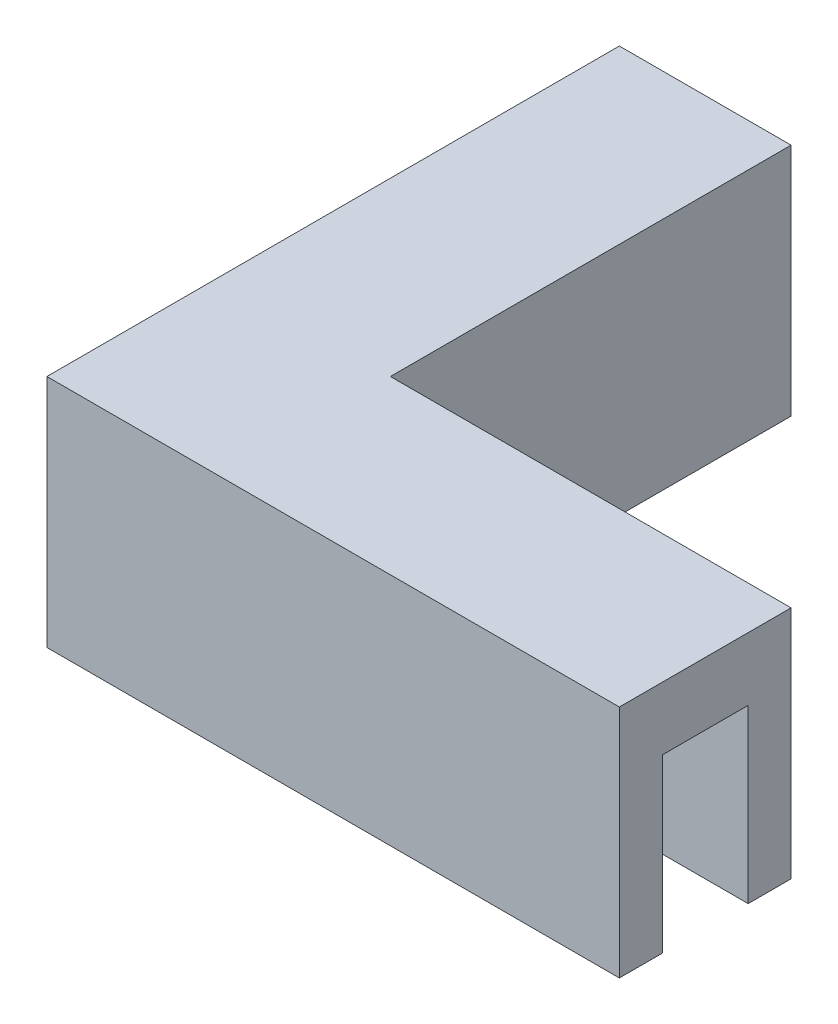
ISO-10303-21;
HEADER;
FILE_DESCRIPTION(('STEP AP214'),'2;1');
FILE_NAME('part.step','',(''),(''),'','','');
FILE_SCHEMA(('AUTOMOTIVE_DESIGN { 1 0 10303 214 1 1 1 1 }'));
ENDSEC;
DATA;
#1=APPLICATION_CONTEXT('core data for automotive mechanical design processes');
#2=APPLICATION_PROTOCOL_DEFINITION('international standard','automotive_design',2000,#1);
#3=PRODUCT_CONTEXT('',#1,'mechanical');
#4=PRODUCT('Part','Part','',(#3));
#5=PRODUCT_RELATED_PRODUCT_CATEGORY('part','',(#4));
#6=PRODUCT_DEFINITION_FORMATION('','',#4);
#7=PRODUCT_DEFINITION_CONTEXT('part definition',#1,'design');
#8=PRODUCT_DEFINITION('design','',#6,#7);
#9=PRODUCT_DEFINITION_SHAPE('','',#8);
#10=(LENGTH_UNIT() NAMED_UNIT(*) SI_UNIT(.MILLI.,.METRE.));
#11=(NAMED_UNIT(*) PLANE_ANGLE_UNIT() SI_UNIT($,.RADIAN.));
#12=(NAMED_UNIT(*) SI_UNIT($,.STERADIAN.) SOLID_ANGLE_UNIT());
#13=UNCERTAINTY_MEASURE_WITH_UNIT(LENGTH_MEASURE(1.E-05),#10,'distance_accuracy_value','');
#14=(GEOMETRIC_REPRESENTATION_CONTEXT(3) GLOBAL_UNCERTAINTY_ASSIGNED_CONTEXT((#13)) GLOBAL_UNIT_ASSIGNED_CONTEXT((#10,
#11,#12)) REPRESENTATION_CONTEXT('',''));
#15=CARTESIAN_POINT('',(0.,0.,0.));
#16=DIRECTION('',(0.,0.,1.));
#17=DIRECTION('',(1.,0.,0.));
#18=AXIS2_PLACEMENT_3D('',#15,#16,#17);
#19=CARTESIAN_POINT('',(0.,0.,0.));
#20=DIRECTION('',(0.,1.,0.));
#21=DIRECTION('',(0.,0.,1.));
#22=AXIS2_PLACEMENT_3D('',#19,#20,#21);
#23=PLANE('',#22);
#24=DIRECTION('',(1.,0.,0.));
#25=VECTOR('',#24,1.);
#26=CARTESIAN_POINT('',(0.,0.,-25.4));
#27=LINE('',#26,#25);
#28=CARTESIAN_POINT('',(1.905,0.,-25.4));
#29=VERTEX_POINT('',#28);
#30=CARTESIAN_POINT('',(5.715,0.,-25.4));
#31=VERTEX_POINT('',#30);
#32=EDGE_CURVE('E94',#29,#31,#27,.T.);
#33=ORIENTED_EDGE('',*,*,#32,.T.);
#34=DIRECTION('',(0.,0.,1.));
#35=VECTOR('',#34,1.);
#36=CARTESIAN_POINT('',(5.715,0.,0.));
#37=LINE('',#36,#35);
#38=CARTESIAN_POINT('',(5.715,0.,-5.715));
#39=VERTEX_POINT('',#38);
#40=EDGE_CURVE('E89',#31,#39,#37,.T.);
#41=ORIENTED_EDGE('',*,*,#40,.T.);
#42=DIRECTION('',(1.,0.,0.));
#43=VECTOR('',#42,1.);
#44=CARTESIAN_POINT('',(0.,0.,-5.715));
#45=LINE('',#44,#43);
#46=CARTESIAN_POINT('',(25.4,0.,-5.715));
#47=VERTEX_POINT('',#46);
#48=EDGE_CURVE('E166',#39,#47,#45,.T.);
#49=ORIENTED_EDGE('',*,*,#48,.T.);
#50=DIRECTION('',(0.,0.,1.));
#51=VECTOR('',#50,1.);
#52=CARTESIAN_POINT('',(25.4,0.,0.));
#53=LINE('',#52,#51);
#54=CARTESIAN_POINT('',(25.4,0.,-1.905));
#55=VERTEX_POINT('',#54);
#56=EDGE_CURVE('E75',#47,#55,#53,.T.);
#57=ORIENTED_EDGE('',*,*,#56,.T.);
#58=DIRECTION('',(1.,0.,0.));
#59=VECTOR('',#58,1.);
#60=CARTESIAN_POINT('',(0.,0.,-1.905));
#61=LINE('',#60,#59);
#62=CARTESIAN_POINT('',(1.905,0.,-1.905));
#63=VERTEX_POINT('',#62);
#64=EDGE_CURVE('E197',#63,#55,#61,.T.);
#65=ORIENTED_EDGE('',*,*,#64,.F.);
#66=DIRECTION('',(0.,0.,1.));
#67=VECTOR('',#66,1.);
#68=CARTESIAN_POINT('',(1.905,0.,0.));
#69=LINE('',#68,#67);
#70=EDGE_CURVE('E203',#29,#63,#69,.T.);
#71=ORIENTED_EDGE('',*,*,#70,.F.);
#72=EDGE_LOOP('',(#33,#41,#49,#57,#65,#71));
#73=FACE_BOUND('',#72,.T.);
#74=ADVANCED_FACE('F71',(#73),#23,.F.);
#75=CARTESIAN_POINT('',(0.,2.794,-25.4));
#76=DIRECTION('',(0.,0.,-1.));
#77=DIRECTION('',(-1.,0.,0.));
#78=AXIS2_PLACEMENT_3D('',#75,#76,#77);
#79=PLANE('',#78);
#80=ORIENTED_EDGE('',*,*,#32,.F.);
#81=DIRECTION('',(0.,1.,0.));
#82=VECTOR('',#81,1.);
#83=CARTESIAN_POINT('',(1.905,-7.62,-25.4));
#84=LINE('',#83,#82);
#85=CARTESIAN_POINT('',(1.905,-7.62,-25.4));
#86=VERTEX_POINT('',#85);
#87=EDGE_CURVE('E227',#86,#29,#84,.T.);
#88=ORIENTED_EDGE('',*,*,#87,.F.);
#89=DIRECTION('',(1.,0.,0.));
#90=VECTOR('',#89,1.);
#91=CARTESIAN_POINT('',(0.,-7.62,-25.4));
#92=LINE('',#91,#90);
#93=CARTESIAN_POINT('',(0.,-7.62,-25.4));
#94=VERTEX_POINT('',#93);
#95=EDGE_CURVE('E205',#94,#86,#92,.T.);
#96=ORIENTED_EDGE('',*,*,#95,.F.);
#97=DIRECTION('',(0.,-1.,0.));
#98=VECTOR('',#97,1.);
#99=CARTESIAN_POINT('',(0.,2.794,-25.4));
#100=LINE('',#99,#98);
#101=CARTESIAN_POINT('',(0.,2.794,-25.4));
#102=VERTEX_POINT('',#101);
#103=EDGE_CURVE('E12',#102,#94,#100,.T.);
#104=ORIENTED_EDGE('',*,*,#103,.F.);
#105=DIRECTION('',(1.,0.,0.));
#106=VECTOR('',#105,1.);
#107=CARTESIAN_POINT('',(0.,2.794,-25.4));
#108=LINE('',#107,#106);
#109=CARTESIAN_POINT('',(7.62,2.794,-25.4));
#110=VERTEX_POINT('',#109);
#111=EDGE_CURVE('E269',#102,#110,#108,.T.);
#112=ORIENTED_EDGE('',*,*,#111,.T.);
#113=DIRECTION('',(0.,-1.,0.));
#114=VECTOR('',#113,1.);
#115=CARTESIAN_POINT('',(7.62,2.794,-25.4));
#116=LINE('',#115,#114);
#117=CARTESIAN_POINT('',(7.62,-7.62,-25.4));
#118=VERTEX_POINT('',#117);
#119=EDGE_CURVE('E244',#110,#118,#116,.T.);
#120=ORIENTED_EDGE('',*,*,#119,.T.);
#121=DIRECTION('',(1.,0.,0.));
#122=VECTOR('',#121,1.);
#123=CARTESIAN_POINT('',(0.,-7.62,-25.4));
#124=LINE('',#123,#122);
#125=CARTESIAN_POINT('',(5.715,-7.62,-25.4));
#126=VERTEX_POINT('',#125);
#127=EDGE_CURVE('E170',#126,#118,#124,.T.);
#128=ORIENTED_EDGE('',*,*,#127,.F.);
#129=DIRECTION('',(0.,1.,0.));
#130=VECTOR('',#129,1.);
#131=CARTESIAN_POINT('',(5.715,-7.62,-25.4));
#132=LINE('',#131,#130);
#133=EDGE_CURVE('E183',#126,#31,#132,.T.);
#134=ORIENTED_EDGE('',*,*,#133,.T.);
#135=EDGE_LOOP('',(#80,#88,#96,#104,#112,#120,#128,#134));
#136=FACE_BOUND('',#135,.T.);
#137=ADVANCED_FACE('F73',(#136),#79,.T.);
#138=CARTESIAN_POINT('',(0.,2.794,0.));
#139=DIRECTION('',(-1.,0.,0.));
#140=DIRECTION('',(0.,0.,1.));
#141=AXIS2_PLACEMENT_3D('',#138,#139,#140);
#142=PLANE('',#141);
#143=ORIENTED_EDGE('',*,*,#103,.T.);
#144=DIRECTION('',(0.,0.,-1.));
#145=VECTOR('',#144,1.);
#146=CARTESIAN_POINT('',(0.,-7.62,0.));
#147=LINE('',#146,#145);
#148=CARTESIAN_POINT('',(0.,-7.62,0.));
#149=VERTEX_POINT('',#148);
#150=EDGE_CURVE('E207',#149,#94,#147,.T.);
#151=ORIENTED_EDGE('',*,*,#150,.F.);
#152=DIRECTION('',(0.,-1.,0.));
#153=VECTOR('',#152,1.);
#154=CARTESIAN_POINT('',(0.,2.794,0.));
#155=LINE('',#154,#153);
#156=CARTESIAN_POINT('',(0.,2.794,0.));
#157=VERTEX_POINT('',#156);
#158=EDGE_CURVE('E81',#157,#149,#155,.T.);
#159=ORIENTED_EDGE('',*,*,#158,.F.);
#160=DIRECTION('',(0.,0.,-1.));
#161=VECTOR('',#160,1.);
#162=CARTESIAN_POINT('',(0.,2.794,0.));
#163=LINE('',#162,#161);
#164=EDGE_CURVE('E265',#157,#102,#163,.T.);
#165=ORIENTED_EDGE('',*,*,#164,.T.);
#166=EDGE_LOOP('',(#143,#151,#159,#165));
#167=FACE_BOUND('',#166,.T.);
#168=ADVANCED_FACE('F264',(#167),#142,.T.);
#169=CARTESIAN_POINT('',(0.,2.794,0.));
#170=DIRECTION('',(0.,0.,1.));
#171=DIRECTION('',(1.,0.,0.));
#172=AXIS2_PLACEMENT_3D('',#169,#170,#171);
#173=PLANE('',#172);
#174=ORIENTED_EDGE('',*,*,#158,.T.);
#175=DIRECTION('',(-1.,0.,0.));
#176=VECTOR('',#175,1.);
#177=CARTESIAN_POINT('',(0.,-7.62,0.));
#178=LINE('',#177,#176);
#179=CARTESIAN_POINT('',(25.4,-7.62,0.));
#180=VERTEX_POINT('',#179);
#181=EDGE_CURVE('E210',#180,#149,#178,.T.);
#182=ORIENTED_EDGE('',*,*,#181,.F.);
#183=DIRECTION('',(0.,-1.,0.));
#184=VECTOR('',#183,1.);
#185=CARTESIAN_POINT('',(25.4,2.794,0.));
#186=LINE('',#185,#184);
#187=CARTESIAN_POINT('',(25.4,2.794,0.));
#188=VERTEX_POINT('',#187);
#189=EDGE_CURVE('E250',#188,#180,#186,.T.);
#190=ORIENTED_EDGE('',*,*,#189,.F.);
#191=DIRECTION('',(-1.,0.,0.));
#192=VECTOR('',#191,1.);
#193=CARTESIAN_POINT('',(0.,2.794,0.));
#194=LINE('',#193,#192);
#195=EDGE_CURVE('E256',#188,#157,#194,.T.);
#196=ORIENTED_EDGE('',*,*,#195,.T.);
#197=EDGE_LOOP('',(#174,#182,#190,#196));
#198=FACE_BOUND('',#197,.T.);
#199=ADVANCED_FACE('F254',(#198),#173,.T.);
#200=CARTESIAN_POINT('',(25.4,2.794,0.));
#201=DIRECTION('',(1.,0.,0.));
#202=DIRECTION('',(0.,0.,-1.));
#203=AXIS2_PLACEMENT_3D('',#200,#201,#202);
#204=PLANE('',#203);
#205=ORIENTED_EDGE('',*,*,#56,.F.);
#206=DIRECTION('',(0.,1.,0.));
#207=VECTOR('',#206,1.);
#208=CARTESIAN_POINT('',(25.4,-7.62,-5.715));
#209=LINE('',#208,#207);
#210=CARTESIAN_POINT('',(25.4,-7.62,-5.715));
#211=VERTEX_POINT('',#210);
#212=EDGE_CURVE('E169',#211,#47,#209,.T.);
#213=ORIENTED_EDGE('',*,*,#212,.F.);
#214=DIRECTION('',(0.,0.,1.));
#215=VECTOR('',#214,1.);
#216=CARTESIAN_POINT('',(25.4,-7.62,0.));
#217=LINE('',#216,#215);
#218=CARTESIAN_POINT('',(25.4,-7.62,-7.62));
#219=VERTEX_POINT('',#218);
#220=EDGE_CURVE('E179',#219,#211,#217,.T.);
#221=ORIENTED_EDGE('',*,*,#220,.F.);
#222=DIRECTION('',(0.,-1.,0.));
#223=VECTOR('',#222,1.);
#224=CARTESIAN_POINT('',(25.4,2.794,-7.62));
#225=LINE('',#224,#223);
#226=CARTESIAN_POINT('',(25.4,2.794,-7.62));
#227=VERTEX_POINT('',#226);
#228=EDGE_CURVE('E248',#227,#219,#225,.T.);
#229=ORIENTED_EDGE('',*,*,#228,.F.);
#230=DIRECTION('',(0.,0.,1.));
#231=VECTOR('',#230,1.);
#232=CARTESIAN_POINT('',(25.4,2.794,0.));
#233=LINE('',#232,#231);
#234=EDGE_CURVE('E279',#227,#188,#233,.T.);
#235=ORIENTED_EDGE('',*,*,#234,.T.);
#236=ORIENTED_EDGE('',*,*,#189,.T.);
#237=DIRECTION('',(0.,0.,1.));
#238=VECTOR('',#237,1.);
#239=CARTESIAN_POINT('',(25.4,-7.62,0.));
#240=LINE('',#239,#238);
#241=CARTESIAN_POINT('',(25.4,-7.62,-1.905));
#242=VERTEX_POINT('',#241);
#243=EDGE_CURVE('E213',#242,#180,#240,.T.);
#244=ORIENTED_EDGE('',*,*,#243,.F.);
#245=DIRECTION('',(0.,1.,0.));
#246=VECTOR('',#245,1.);
#247=CARTESIAN_POINT('',(25.4,-7.62,-1.905));
#248=LINE('',#247,#246);
#249=EDGE_CURVE('E224',#242,#55,#248,.T.);
#250=ORIENTED_EDGE('',*,*,#249,.T.);
#251=EDGE_LOOP('',(#205,#213,#221,#229,#235,#236,#244,#250));
#252=FACE_BOUND('',#251,.T.);
#253=ADVANCED_FACE('F292',(#252),#204,.T.);
#254=CARTESIAN_POINT('',(0.,2.794,-7.62));
#255=DIRECTION('',(0.,0.,-1.));
#256=DIRECTION('',(-1.,0.,0.));
#257=AXIS2_PLACEMENT_3D('',#254,#255,#256);
#258=PLANE('',#257);
#259=ORIENTED_EDGE('',*,*,#228,.T.);
#260=DIRECTION('',(1.,0.,0.));
#261=VECTOR('',#260,1.);
#262=CARTESIAN_POINT('',(0.,-7.62,-7.62));
#263=LINE('',#262,#261);
#264=CARTESIAN_POINT('',(7.62,-7.62,-7.62));
#265=VERTEX_POINT('',#264);
#266=EDGE_CURVE('E189',#265,#219,#263,.T.);
#267=ORIENTED_EDGE('',*,*,#266,.F.);
#268=DIRECTION('',(0.,-1.,0.));
#269=VECTOR('',#268,1.);
#270=CARTESIAN_POINT('',(7.62,2.794,-7.62));
#271=LINE('',#270,#269);
#272=CARTESIAN_POINT('',(7.62,2.794,-7.62));
#273=VERTEX_POINT('',#272);
#274=EDGE_CURVE('E246',#273,#265,#271,.T.);
#275=ORIENTED_EDGE('',*,*,#274,.F.);
#276=DIRECTION('',(1.,0.,0.));
#277=VECTOR('',#276,1.);
#278=CARTESIAN_POINT('',(0.,2.794,-7.62));
#279=LINE('',#278,#277);
#280=EDGE_CURVE('E281',#273,#227,#279,.T.);
#281=ORIENTED_EDGE('',*,*,#280,.T.);
#282=EDGE_LOOP('',(#259,#267,#275,#281));
#283=FACE_BOUND('',#282,.T.);
#284=ADVANCED_FACE('F288',(#283),#258,.T.);
#285=CARTESIAN_POINT('',(7.62,2.794,0.));
#286=DIRECTION('',(1.,0.,0.));
#287=DIRECTION('',(0.,0.,-1.));
#288=AXIS2_PLACEMENT_3D('',#285,#286,#287);
#289=PLANE('',#288);
#290=ORIENTED_EDGE('',*,*,#274,.T.);
#291=DIRECTION('',(0.,0.,1.));
#292=VECTOR('',#291,1.);
#293=CARTESIAN_POINT('',(7.62,-7.62,0.));
#294=LINE('',#293,#292);
#295=EDGE_CURVE('E191',#118,#265,#294,.T.);
#296=ORIENTED_EDGE('',*,*,#295,.F.);
#297=ORIENTED_EDGE('',*,*,#119,.F.);
#298=DIRECTION('',(0.,0.,1.));
#299=VECTOR('',#298,1.);
#300=CARTESIAN_POINT('',(7.62,2.794,0.));
#301=LINE('',#300,#299);
#302=EDGE_CURVE('E240',#110,#273,#301,.T.);
#303=ORIENTED_EDGE('',*,*,#302,.T.);
#304=EDGE_LOOP('',(#290,#296,#297,#303));
#305=FACE_BOUND('',#304,.T.);
#306=ADVANCED_FACE('F285',(#305),#289,.T.);
#307=CARTESIAN_POINT('',(0.,2.794,0.));
#308=DIRECTION('',(0.,1.,0.));
#309=DIRECTION('',(0.,0.,1.));
#310=AXIS2_PLACEMENT_3D('',#307,#308,#309);
#311=PLANE('',#310);
#312=ORIENTED_EDGE('',*,*,#111,.F.);
#313=ORIENTED_EDGE('',*,*,#164,.F.);
#314=ORIENTED_EDGE('',*,*,#195,.F.);
#315=ORIENTED_EDGE('',*,*,#234,.F.);
#316=ORIENTED_EDGE('',*,*,#280,.F.);
#317=ORIENTED_EDGE('',*,*,#302,.F.);
#318=EDGE_LOOP('',(#312,#313,#314,#315,#316,#317));
#319=FACE_BOUND('',#318,.T.);
#320=ADVANCED_FACE('F273',(#319),#311,.T.);
#321=CARTESIAN_POINT('',(0.,-7.62,-1.905));
#322=DIRECTION('',(0.,0.,1.));
#323=DIRECTION('',(1.,0.,0.));
#324=AXIS2_PLACEMENT_3D('',#321,#322,#323);
#325=PLANE('',#324);
#326=ORIENTED_EDGE('',*,*,#64,.T.);
#327=ORIENTED_EDGE('',*,*,#249,.F.);
#328=DIRECTION('',(1.,0.,0.));
#329=VECTOR('',#328,1.);
#330=CARTESIAN_POINT('',(0.,-7.62,-1.905));
#331=LINE('',#330,#329);
#332=CARTESIAN_POINT('',(1.905,-7.62,-1.905));
#333=VERTEX_POINT('',#332);
#334=EDGE_CURVE('E199',#333,#242,#331,.T.);
#335=ORIENTED_EDGE('',*,*,#334,.F.);
#336=DIRECTION('',(0.,1.,0.));
#337=VECTOR('',#336,1.);
#338=CARTESIAN_POINT('',(1.905,-7.62,-1.905));
#339=LINE('',#338,#337);
#340=EDGE_CURVE('E216',#333,#63,#339,.T.);
#341=ORIENTED_EDGE('',*,*,#340,.T.);
#342=EDGE_LOOP('',(#326,#327,#335,#341));
#343=FACE_BOUND('',#342,.T.);
#344=ADVANCED_FACE('F301',(#343),#325,.F.);
#345=CARTESIAN_POINT('',(1.905,-7.62,0.));
#346=DIRECTION('',(-1.,0.,0.));
#347=DIRECTION('',(0.,0.,1.));
#348=AXIS2_PLACEMENT_3D('',#345,#346,#347);
#349=PLANE('',#348);
#350=ORIENTED_EDGE('',*,*,#70,.T.);
#351=ORIENTED_EDGE('',*,*,#340,.F.);
#352=DIRECTION('',(0.,0.,1.));
#353=VECTOR('',#352,1.);
#354=CARTESIAN_POINT('',(1.905,-7.62,0.));
#355=LINE('',#354,#353);
#356=EDGE_CURVE('E202',#86,#333,#355,.T.);
#357=ORIENTED_EDGE('',*,*,#356,.F.);
#358=ORIENTED_EDGE('',*,*,#87,.T.);
#359=EDGE_LOOP('',(#350,#351,#357,#358));
#360=FACE_BOUND('',#359,.T.);
#361=ADVANCED_FACE('F298',(#360),#349,.F.);
#362=CARTESIAN_POINT('',(0.,-7.62,0.));
#363=DIRECTION('',(0.,1.,0.));
#364=DIRECTION('',(0.,0.,1.));
#365=AXIS2_PLACEMENT_3D('',#362,#363,#364);
#366=PLANE('',#365);
#367=ORIENTED_EDGE('',*,*,#334,.T.);
#368=ORIENTED_EDGE('',*,*,#243,.T.);
#369=ORIENTED_EDGE('',*,*,#181,.T.);
#370=ORIENTED_EDGE('',*,*,#150,.T.);
#371=ORIENTED_EDGE('',*,*,#95,.T.);
#372=ORIENTED_EDGE('',*,*,#356,.T.);
#373=EDGE_LOOP('',(#367,#368,#369,#370,#371,#372));
#374=FACE_BOUND('',#373,.T.);
#375=ADVANCED_FACE('F262',(#374),#366,.F.);
#376=CARTESIAN_POINT('',(5.715,-7.62,0.));
#377=DIRECTION('',(-1.,0.,0.));
#378=DIRECTION('',(0.,0.,1.));
#379=AXIS2_PLACEMENT_3D('',#376,#377,#378);
#380=PLANE('',#379);
#381=ORIENTED_EDGE('',*,*,#40,.F.);
#382=ORIENTED_EDGE('',*,*,#133,.F.);
#383=DIRECTION('',(0.,0.,1.));
#384=VECTOR('',#383,1.);
#385=CARTESIAN_POINT('',(5.715,-7.62,0.));
#386=LINE('',#385,#384);
#387=CARTESIAN_POINT('',(5.715,-7.62,-5.715));
#388=VERTEX_POINT('',#387);
#389=EDGE_CURVE('E176',#126,#388,#386,.T.);
#390=ORIENTED_EDGE('',*,*,#389,.T.);
#391=DIRECTION('',(0.,1.,0.));
#392=VECTOR('',#391,1.);
#393=CARTESIAN_POINT('',(5.715,-7.62,-5.715));
#394=LINE('',#393,#392);
#395=EDGE_CURVE('E161',#388,#39,#394,.T.);
#396=ORIENTED_EDGE('',*,*,#395,.T.);
#397=EDGE_LOOP('',(#381,#382,#390,#396));
#398=FACE_BOUND('',#397,.T.);
#399=ADVANCED_FACE('F182',(#398),#380,.T.);
#400=CARTESIAN_POINT('',(0.,-7.62,-5.715));
#401=DIRECTION('',(0.,0.,1.));
#402=DIRECTION('',(1.,0.,0.));
#403=AXIS2_PLACEMENT_3D('',#400,#401,#402);
#404=PLANE('',#403);
#405=ORIENTED_EDGE('',*,*,#48,.F.);
#406=ORIENTED_EDGE('',*,*,#395,.F.);
#407=DIRECTION('',(1.,0.,0.));
#408=VECTOR('',#407,1.);
#409=CARTESIAN_POINT('',(0.,-7.62,-5.715));
#410=LINE('',#409,#408);
#411=EDGE_CURVE('E165',#388,#211,#410,.T.);
#412=ORIENTED_EDGE('',*,*,#411,.T.);
#413=ORIENTED_EDGE('',*,*,#212,.T.);
#414=EDGE_LOOP('',(#405,#406,#412,#413));
#415=FACE_BOUND('',#414,.T.);
#416=ADVANCED_FACE('F163',(#415),#404,.T.);
#417=CARTESIAN_POINT('',(0.,-7.62,0.));
#418=DIRECTION('',(0.,1.,0.));
#419=DIRECTION('',(0.,0.,1.));
#420=AXIS2_PLACEMENT_3D('',#417,#418,#419);
#421=PLANE('',#420);
#422=ORIENTED_EDGE('',*,*,#389,.F.);
#423=ORIENTED_EDGE('',*,*,#127,.T.);
#424=ORIENTED_EDGE('',*,*,#295,.T.);
#425=ORIENTED_EDGE('',*,*,#266,.T.);
#426=ORIENTED_EDGE('',*,*,#220,.T.);
#427=ORIENTED_EDGE('',*,*,#411,.F.);
#428=EDGE_LOOP('',(#422,#423,#424,#425,#426,#427));
#429=FACE_BOUND('',#428,.T.);
#430=ADVANCED_FACE('F174',(#429),#421,.F.);
#431=CLOSED_SHELL('',(#74,#137,#168,#199,#253,#284,#306,#320,#344,#361,#375,#399,#416,#430));
#432=MANIFOLD_SOLID_BREP('B2',#431);
#433=ADVANCED_BREP_SHAPE_REPRESENTATION('',(#18,#432),#14);
#434=SHAPE_DEFINITION_REPRESENTATION(#9,#433);
ENDSEC;
END-ISO-10303-21;
